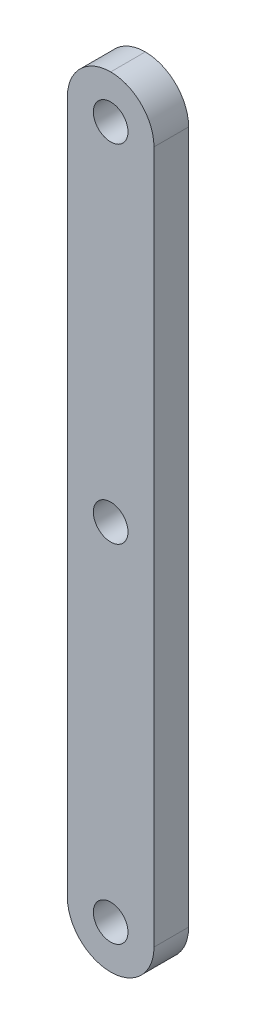
ISO-10303-21;
HEADER;
FILE_DESCRIPTION(('STEP AP214'),'2;1');
FILE_NAME('part.step','',(''),(''),'','','');
FILE_SCHEMA(('AUTOMOTIVE_DESIGN { 1 0 10303 214 1 1 1 1 }'));
ENDSEC;
DATA;
#1=APPLICATION_CONTEXT('core data for automotive mechanical design processes');
#2=APPLICATION_PROTOCOL_DEFINITION('international standard','automotive_design',2000,#1);
#3=PRODUCT_CONTEXT('',#1,'mechanical');
#4=PRODUCT('Part','Part','',(#3));
#5=PRODUCT_RELATED_PRODUCT_CATEGORY('part','',(#4));
#6=PRODUCT_DEFINITION_FORMATION('','',#4);
#7=PRODUCT_DEFINITION_CONTEXT('part definition',#1,'design');
#8=PRODUCT_DEFINITION('design','',#6,#7);
#9=PRODUCT_DEFINITION_SHAPE('','',#8);
#10=(LENGTH_UNIT() NAMED_UNIT(*) SI_UNIT(.MILLI.,.METRE.));
#11=(NAMED_UNIT(*) PLANE_ANGLE_UNIT() SI_UNIT($,.RADIAN.));
#12=(NAMED_UNIT(*) SI_UNIT($,.STERADIAN.) SOLID_ANGLE_UNIT());
#13=UNCERTAINTY_MEASURE_WITH_UNIT(LENGTH_MEASURE(1.E-05),#10,'distance_accuracy_value','');
#14=(GEOMETRIC_REPRESENTATION_CONTEXT(3) GLOBAL_UNCERTAINTY_ASSIGNED_CONTEXT((#13)) GLOBAL_UNIT_ASSIGNED_CONTEXT((#10,
#11,#12)) REPRESENTATION_CONTEXT('',''));
#15=CARTESIAN_POINT('',(0.,0.,0.));
#16=DIRECTION('',(0.,0.,1.));
#17=DIRECTION('',(1.,0.,0.));
#18=AXIS2_PLACEMENT_3D('',#15,#16,#17);
#19=CARTESIAN_POINT('',(-25.,-225.,20.));
#20=DIRECTION('',(1.,0.,0.));
#21=DIRECTION('',(0.,0.,-1.));
#22=AXIS2_PLACEMENT_3D('',#19,#20,#21);
#23=PLANE('',#22);
#24=DIRECTION('',(0.,-1.,0.));
#25=VECTOR('',#24,1.);
#26=CARTESIAN_POINT('',(-25.,-225.,0.));
#27=LINE('',#26,#25);
#28=CARTESIAN_POINT('',(-25.,200.,0.));
#29=VERTEX_POINT('',#28);
#30=CARTESIAN_POINT('',(-25.,-200.,0.));
#31=VERTEX_POINT('',#30);
#32=EDGE_CURVE('E102',#29,#31,#27,.T.);
#33=ORIENTED_EDGE('',*,*,#32,.T.);
#34=DIRECTION('',(0.,0.,-1.));
#35=VECTOR('',#34,1.);
#36=CARTESIAN_POINT('',(-25.,-200.,20.));
#37=LINE('',#36,#35);
#38=CARTESIAN_POINT('',(-25.,-200.,20.));
#39=VERTEX_POINT('',#38);
#40=EDGE_CURVE('E106',#31,#39,#37,.F.);
#41=ORIENTED_EDGE('',*,*,#40,.T.);
#42=DIRECTION('',(0.,-1.,0.));
#43=VECTOR('',#42,1.);
#44=CARTESIAN_POINT('',(-25.,-225.,20.));
#45=LINE('',#44,#43);
#46=CARTESIAN_POINT('',(-25.,200.,20.));
#47=VERTEX_POINT('',#46);
#48=EDGE_CURVE('E105',#47,#39,#45,.T.);
#49=ORIENTED_EDGE('',*,*,#48,.F.);
#50=DIRECTION('',(0.,0.,-1.));
#51=VECTOR('',#50,1.);
#52=CARTESIAN_POINT('',(-25.,200.,20.));
#53=LINE('',#52,#51);
#54=EDGE_CURVE('E91',#47,#29,#53,.T.);
#55=ORIENTED_EDGE('',*,*,#54,.T.);
#56=EDGE_LOOP('',(#33,#41,#49,#55));
#57=FACE_BOUND('',#56,.T.);
#58=ADVANCED_FACE('F32',(#57),#23,.F.);
#59=CARTESIAN_POINT('',(25.,-225.,20.));
#60=DIRECTION('',(-1.,0.,0.));
#61=DIRECTION('',(0.,0.,1.));
#62=AXIS2_PLACEMENT_3D('',#59,#60,#61);
#63=PLANE('',#62);
#64=DIRECTION('',(0.,1.,0.));
#65=VECTOR('',#64,1.);
#66=CARTESIAN_POINT('',(25.,-225.,20.));
#67=LINE('',#66,#65);
#68=CARTESIAN_POINT('',(25.,-200.,20.));
#69=VERTEX_POINT('',#68);
#70=CARTESIAN_POINT('',(25.,200.,20.));
#71=VERTEX_POINT('',#70);
#72=EDGE_CURVE('E119',#69,#71,#67,.T.);
#73=ORIENTED_EDGE('',*,*,#72,.F.);
#74=DIRECTION('',(0.,0.,-1.));
#75=VECTOR('',#74,1.);
#76=CARTESIAN_POINT('',(25.,-200.,20.));
#77=LINE('',#76,#75);
#78=CARTESIAN_POINT('',(25.,-200.,0.));
#79=VERTEX_POINT('',#78);
#80=EDGE_CURVE('E11',#69,#79,#77,.T.);
#81=ORIENTED_EDGE('',*,*,#80,.T.);
#82=DIRECTION('',(0.,1.,0.));
#83=VECTOR('',#82,1.);
#84=CARTESIAN_POINT('',(25.,-225.,0.));
#85=LINE('',#84,#83);
#86=CARTESIAN_POINT('',(25.,200.,0.));
#87=VERTEX_POINT('',#86);
#88=EDGE_CURVE('E111',#79,#87,#85,.T.);
#89=ORIENTED_EDGE('',*,*,#88,.T.);
#90=DIRECTION('',(0.,0.,-1.));
#91=VECTOR('',#90,1.);
#92=CARTESIAN_POINT('',(25.,200.,20.));
#93=LINE('',#92,#91);
#94=EDGE_CURVE('E41',#87,#71,#93,.F.);
#95=ORIENTED_EDGE('',*,*,#94,.T.);
#96=EDGE_LOOP('',(#73,#81,#89,#95));
#97=FACE_BOUND('',#96,.T.);
#98=ADVANCED_FACE('F156',(#97),#63,.F.);
#99=CARTESIAN_POINT('',(0.,0.,20.));
#100=DIRECTION('',(0.,0.,-1.));
#101=DIRECTION('',(-1.,0.,0.));
#102=AXIS2_PLACEMENT_3D('',#99,#100,#101);
#103=PLANE('',#102);
#104=CARTESIAN_POINT('',(0.,200.,20.));
#105=DIRECTION('',(0.,0.,1.));
#106=DIRECTION('',(1.,0.,0.));
#107=AXIS2_PLACEMENT_3D('',#104,#105,#106);
#108=CIRCLE('',#107,10.);
#109=CARTESIAN_POINT('',(10.,200.,20.));
#110=VERTEX_POINT('',#109);
#111=EDGE_CURVE('E149',#110,#110,#108,.T.);
#112=ORIENTED_EDGE('',*,*,#111,.F.);
#113=EDGE_LOOP('',(#112));
#114=FACE_BOUND('',#113,.T.);
#115=CARTESIAN_POINT('',(0.,0.,20.));
#116=DIRECTION('',(0.,0.,1.));
#117=DIRECTION('',(1.,0.,0.));
#118=AXIS2_PLACEMENT_3D('',#115,#116,#117);
#119=CIRCLE('',#118,10.);
#120=CARTESIAN_POINT('',(10.,0.,20.));
#121=VERTEX_POINT('',#120);
#122=EDGE_CURVE('E139',#121,#121,#119,.T.);
#123=ORIENTED_EDGE('',*,*,#122,.F.);
#124=EDGE_LOOP('',(#123));
#125=FACE_BOUND('',#124,.T.);
#126=CARTESIAN_POINT('',(0.,-200.,20.));
#127=DIRECTION('',(0.,0.,1.));
#128=DIRECTION('',(1.,0.,0.));
#129=AXIS2_PLACEMENT_3D('',#126,#127,#128);
#130=CIRCLE('',#129,10.);
#131=CARTESIAN_POINT('',(10.,-200.,20.));
#132=VERTEX_POINT('',#131);
#133=EDGE_CURVE('E112',#132,#132,#130,.T.);
#134=ORIENTED_EDGE('',*,*,#133,.F.);
#135=EDGE_LOOP('',(#134));
#136=FACE_BOUND('',#135,.T.);
#137=ORIENTED_EDGE('',*,*,#48,.T.);
#138=CARTESIAN_POINT('',(0.,-200.,20.));
#139=DIRECTION('',(0.,0.,-1.));
#140=DIRECTION('',(-1.,0.,0.));
#141=AXIS2_PLACEMENT_3D('',#138,#139,#140);
#142=CIRCLE('',#141,25.);
#143=CARTESIAN_POINT('',(0.,-225.,20.));
#144=VERTEX_POINT('',#143);
#145=EDGE_CURVE('E131',#39,#144,#142,.F.);
#146=ORIENTED_EDGE('',*,*,#145,.T.);
#147=CARTESIAN_POINT('',(0.,-200.,20.));
#148=DIRECTION('',(0.,0.,-1.));
#149=DIRECTION('',(-1.,0.,0.));
#150=AXIS2_PLACEMENT_3D('',#147,#148,#149);
#151=CIRCLE('',#150,25.);
#152=EDGE_CURVE('E129',#144,#69,#151,.F.);
#153=ORIENTED_EDGE('',*,*,#152,.T.);
#154=ORIENTED_EDGE('',*,*,#72,.T.);
#155=CARTESIAN_POINT('',(0.,200.,20.));
#156=DIRECTION('',(0.,0.,-1.));
#157=DIRECTION('',(-1.,0.,0.));
#158=AXIS2_PLACEMENT_3D('',#155,#156,#157);
#159=CIRCLE('',#158,25.);
#160=CARTESIAN_POINT('',(0.,225.,20.));
#161=VERTEX_POINT('',#160);
#162=EDGE_CURVE('E49',#71,#161,#159,.F.);
#163=ORIENTED_EDGE('',*,*,#162,.T.);
#164=CARTESIAN_POINT('',(0.,200.,20.));
#165=DIRECTION('',(0.,0.,-1.));
#166=DIRECTION('',(-1.,0.,0.));
#167=AXIS2_PLACEMENT_3D('',#164,#165,#166);
#168=CIRCLE('',#167,25.);
#169=EDGE_CURVE('E127',#161,#47,#168,.F.);
#170=ORIENTED_EDGE('',*,*,#169,.T.);
#171=EDGE_LOOP('',(#137,#146,#153,#154,#163,#170));
#172=FACE_BOUND('',#171,.T.);
#173=ADVANCED_FACE('F150',(#114,#125,#136,#172),#103,.F.);
#174=CARTESIAN_POINT('',(0.,0.,0.));
#175=DIRECTION('',(0.,0.,-1.));
#176=DIRECTION('',(-1.,0.,0.));
#177=AXIS2_PLACEMENT_3D('',#174,#175,#176);
#178=PLANE('',#177);
#179=CARTESIAN_POINT('',(0.,200.,0.));
#180=DIRECTION('',(0.,0.,-1.));
#181=DIRECTION('',(-1.,0.,0.));
#182=AXIS2_PLACEMENT_3D('',#179,#180,#181);
#183=CIRCLE('',#182,10.);
#184=CARTESIAN_POINT('',(-10.,200.,0.));
#185=VERTEX_POINT('',#184);
#186=EDGE_CURVE('E144',#185,#185,#183,.F.);
#187=ORIENTED_EDGE('',*,*,#186,.T.);
#188=EDGE_LOOP('',(#187));
#189=FACE_BOUND('',#188,.T.);
#190=CARTESIAN_POINT('',(0.,0.,0.));
#191=DIRECTION('',(0.,0.,-1.));
#192=DIRECTION('',(-1.,0.,0.));
#193=AXIS2_PLACEMENT_3D('',#190,#191,#192);
#194=CIRCLE('',#193,10.);
#195=CARTESIAN_POINT('',(-10.,0.,0.));
#196=VERTEX_POINT('',#195);
#197=EDGE_CURVE('E135',#196,#196,#194,.F.);
#198=ORIENTED_EDGE('',*,*,#197,.T.);
#199=EDGE_LOOP('',(#198));
#200=FACE_BOUND('',#199,.T.);
#201=CARTESIAN_POINT('',(0.,-200.,0.));
#202=DIRECTION('',(0.,0.,-1.));
#203=DIRECTION('',(-1.,0.,0.));
#204=AXIS2_PLACEMENT_3D('',#201,#202,#203);
#205=CIRCLE('',#204,10.);
#206=CARTESIAN_POINT('',(-10.,-200.,0.));
#207=VERTEX_POINT('',#206);
#208=EDGE_CURVE('E116',#207,#207,#205,.F.);
#209=ORIENTED_EDGE('',*,*,#208,.T.);
#210=EDGE_LOOP('',(#209));
#211=FACE_BOUND('',#210,.T.);
#212=CARTESIAN_POINT('',(0.,-200.,0.));
#213=DIRECTION('',(0.,0.,-1.));
#214=DIRECTION('',(-1.,0.,0.));
#215=AXIS2_PLACEMENT_3D('',#212,#213,#214);
#216=CIRCLE('',#215,25.);
#217=CARTESIAN_POINT('',(0.,-225.,0.));
#218=VERTEX_POINT('',#217);
#219=EDGE_CURVE('E95',#79,#218,#216,.T.);
#220=ORIENTED_EDGE('',*,*,#219,.T.);
#221=CARTESIAN_POINT('',(0.,-200.,0.));
#222=DIRECTION('',(0.,0.,-1.));
#223=DIRECTION('',(-1.,0.,0.));
#224=AXIS2_PLACEMENT_3D('',#221,#222,#223);
#225=CIRCLE('',#224,25.);
#226=EDGE_CURVE('E107',#218,#31,#225,.T.);
#227=ORIENTED_EDGE('',*,*,#226,.T.);
#228=ORIENTED_EDGE('',*,*,#32,.F.);
#229=CARTESIAN_POINT('',(0.,200.,0.));
#230=DIRECTION('',(0.,0.,-1.));
#231=DIRECTION('',(-1.,0.,0.));
#232=AXIS2_PLACEMENT_3D('',#229,#230,#231);
#233=CIRCLE('',#232,25.);
#234=CARTESIAN_POINT('',(0.,225.,0.));
#235=VERTEX_POINT('',#234);
#236=EDGE_CURVE('E87',#29,#235,#233,.T.);
#237=ORIENTED_EDGE('',*,*,#236,.T.);
#238=CARTESIAN_POINT('',(0.,200.,0.));
#239=DIRECTION('',(0.,0.,-1.));
#240=DIRECTION('',(-1.,0.,0.));
#241=AXIS2_PLACEMENT_3D('',#238,#239,#240);
#242=CIRCLE('',#241,25.);
#243=EDGE_CURVE('E96',#235,#87,#242,.T.);
#244=ORIENTED_EDGE('',*,*,#243,.T.);
#245=ORIENTED_EDGE('',*,*,#88,.F.);
#246=EDGE_LOOP('',(#220,#227,#228,#237,#244,#245));
#247=FACE_BOUND('',#246,.T.);
#248=ADVANCED_FACE('F109',(#189,#200,#211,#247),#178,.T.);
#249=CARTESIAN_POINT('',(0.,-200.,-0.001000000000001));
#250=DIRECTION('',(0.,0.,1.));
#251=DIRECTION('',(1.,0.,0.));
#252=AXIS2_PLACEMENT_3D('',#249,#250,#251);
#253=CYLINDRICAL_SURFACE('',#252,10.);
#254=ORIENTED_EDGE('',*,*,#208,.F.);
#255=EDGE_LOOP('',(#254));
#256=FACE_BOUND('',#255,.T.);
#257=ORIENTED_EDGE('',*,*,#133,.T.);
#258=EDGE_LOOP('',(#257));
#259=FACE_BOUND('',#258,.T.);
#260=ADVANCED_FACE('F177',(#256,#259),#253,.F.);
#261=CARTESIAN_POINT('',(0.,0.,-0.001000000000001));
#262=DIRECTION('',(0.,0.,1.));
#263=DIRECTION('',(1.,0.,0.));
#264=AXIS2_PLACEMENT_3D('',#261,#262,#263);
#265=CYLINDRICAL_SURFACE('',#264,10.);
#266=ORIENTED_EDGE('',*,*,#197,.F.);
#267=EDGE_LOOP('',(#266));
#268=FACE_BOUND('',#267,.T.);
#269=ORIENTED_EDGE('',*,*,#122,.T.);
#270=EDGE_LOOP('',(#269));
#271=FACE_BOUND('',#270,.T.);
#272=ADVANCED_FACE('F184',(#268,#271),#265,.F.);
#273=CARTESIAN_POINT('',(0.,200.,-0.001000000000001));
#274=DIRECTION('',(0.,0.,1.));
#275=DIRECTION('',(1.,0.,0.));
#276=AXIS2_PLACEMENT_3D('',#273,#274,#275);
#277=CYLINDRICAL_SURFACE('',#276,10.);
#278=ORIENTED_EDGE('',*,*,#186,.F.);
#279=EDGE_LOOP('',(#278));
#280=FACE_BOUND('',#279,.T.);
#281=ORIENTED_EDGE('',*,*,#111,.T.);
#282=EDGE_LOOP('',(#281));
#283=FACE_BOUND('',#282,.T.);
#284=ADVANCED_FACE('F166',(#280,#283),#277,.F.);
#285=CARTESIAN_POINT('',(0.,-200.,20.));
#286=DIRECTION('',(0.,0.,-1.));
#287=DIRECTION('',(-1.,0.,0.));
#288=AXIS2_PLACEMENT_3D('',#285,#286,#287);
#289=CYLINDRICAL_SURFACE('',#288,25.);
#290=ORIENTED_EDGE('',*,*,#80,.F.);
#291=ORIENTED_EDGE('',*,*,#152,.F.);
#292=DIRECTION('',(0.,0.,-1.));
#293=VECTOR('',#292,1.);
#294=CARTESIAN_POINT('',(0.,-225.,20.));
#295=LINE('',#294,#293);
#296=EDGE_CURVE('E133',#218,#144,#295,.F.);
#297=ORIENTED_EDGE('',*,*,#296,.F.);
#298=ORIENTED_EDGE('',*,*,#219,.F.);
#299=EDGE_LOOP('',(#290,#291,#297,#298));
#300=FACE_BOUND('',#299,.T.);
#301=ADVANCED_FACE('F158',(#300),#289,.T.);
#302=CARTESIAN_POINT('',(0.,-200.,20.));
#303=DIRECTION('',(0.,0.,-1.));
#304=DIRECTION('',(-1.,0.,0.));
#305=AXIS2_PLACEMENT_3D('',#302,#303,#304);
#306=CYLINDRICAL_SURFACE('',#305,25.);
#307=ORIENTED_EDGE('',*,*,#145,.F.);
#308=ORIENTED_EDGE('',*,*,#40,.F.);
#309=ORIENTED_EDGE('',*,*,#226,.F.);
#310=ORIENTED_EDGE('',*,*,#296,.T.);
#311=EDGE_LOOP('',(#307,#308,#309,#310));
#312=FACE_BOUND('',#311,.T.);
#313=ADVANCED_FACE('F159',(#312),#306,.T.);
#314=CARTESIAN_POINT('',(0.,200.,20.));
#315=DIRECTION('',(0.,0.,-1.));
#316=DIRECTION('',(-1.,0.,0.));
#317=AXIS2_PLACEMENT_3D('',#314,#315,#316);
#318=CYLINDRICAL_SURFACE('',#317,25.);
#319=DIRECTION('',(0.,0.,-1.));
#320=VECTOR('',#319,1.);
#321=CARTESIAN_POINT('',(0.,225.,20.));
#322=LINE('',#321,#320);
#323=EDGE_CURVE('E36',#161,#235,#322,.T.);
#324=ORIENTED_EDGE('',*,*,#323,.F.);
#325=ORIENTED_EDGE('',*,*,#162,.F.);
#326=ORIENTED_EDGE('',*,*,#94,.F.);
#327=ORIENTED_EDGE('',*,*,#243,.F.);
#328=EDGE_LOOP('',(#324,#325,#326,#327));
#329=FACE_BOUND('',#328,.T.);
#330=ADVANCED_FACE('F34',(#329),#318,.T.);
#331=CARTESIAN_POINT('',(0.,200.,20.));
#332=DIRECTION('',(0.,0.,-1.));
#333=DIRECTION('',(-1.,0.,0.));
#334=AXIS2_PLACEMENT_3D('',#331,#332,#333);
#335=CYLINDRICAL_SURFACE('',#334,25.);
#336=ORIENTED_EDGE('',*,*,#169,.F.);
#337=ORIENTED_EDGE('',*,*,#323,.T.);
#338=ORIENTED_EDGE('',*,*,#236,.F.);
#339=ORIENTED_EDGE('',*,*,#54,.F.);
#340=EDGE_LOOP('',(#336,#337,#338,#339));
#341=FACE_BOUND('',#340,.T.);
#342=ADVANCED_FACE('F90',(#341),#335,.T.);
#343=CLOSED_SHELL('',(#58,#98,#173,#248,#260,#272,#284,#301,#313,#330,#342));
#344=MANIFOLD_SOLID_BREP('B2',#343);
#345=ADVANCED_BREP_SHAPE_REPRESENTATION('',(#18,#344),#14);
#346=SHAPE_DEFINITION_REPRESENTATION(#9,#345);
ENDSEC;
END-ISO-10303-21;
